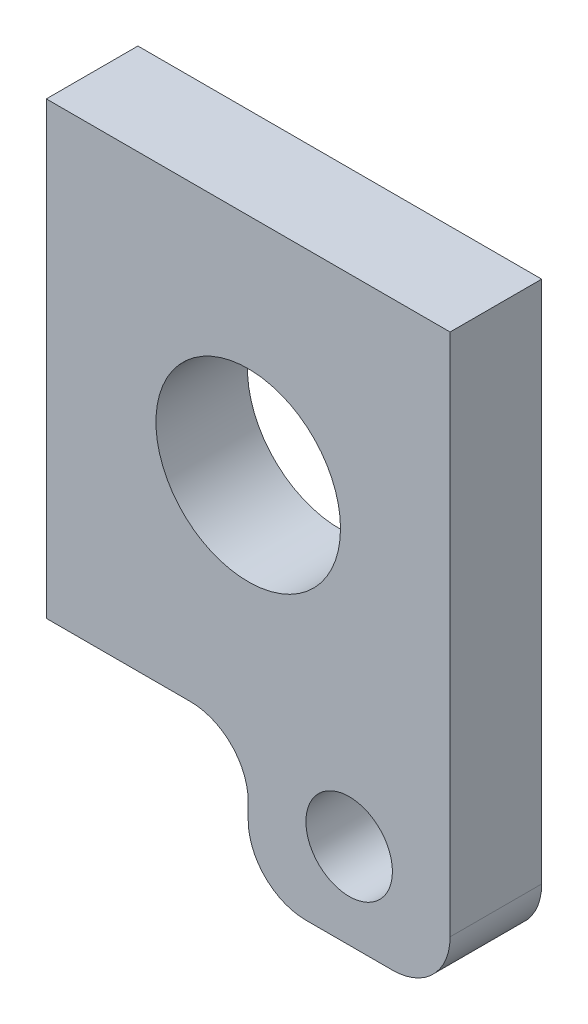
ISO-10303-21;
HEADER;
FILE_DESCRIPTION(('STEP AP214'),'2;1');
FILE_NAME('part.step','',(''),(''),'','','');
FILE_SCHEMA(('AUTOMOTIVE_DESIGN { 1 0 10303 214 1 1 1 1 }'));
ENDSEC;
DATA;
#1=APPLICATION_CONTEXT('core data for automotive mechanical design processes');
#2=APPLICATION_PROTOCOL_DEFINITION('international standard','automotive_design',2000,#1);
#3=PRODUCT_CONTEXT('',#1,'mechanical');
#4=PRODUCT('Part','Part','',(#3));
#5=PRODUCT_RELATED_PRODUCT_CATEGORY('part','',(#4));
#6=PRODUCT_DEFINITION_FORMATION('','',#4);
#7=PRODUCT_DEFINITION_CONTEXT('part definition',#1,'design');
#8=PRODUCT_DEFINITION('design','',#6,#7);
#9=PRODUCT_DEFINITION_SHAPE('','',#8);
#10=(LENGTH_UNIT() NAMED_UNIT(*) SI_UNIT(.MILLI.,.METRE.));
#11=(NAMED_UNIT(*) PLANE_ANGLE_UNIT() SI_UNIT($,.RADIAN.));
#12=(NAMED_UNIT(*) SI_UNIT($,.STERADIAN.) SOLID_ANGLE_UNIT());
#13=UNCERTAINTY_MEASURE_WITH_UNIT(LENGTH_MEASURE(1.E-05),#10,'distance_accuracy_value','');
#14=(GEOMETRIC_REPRESENTATION_CONTEXT(3) GLOBAL_UNCERTAINTY_ASSIGNED_CONTEXT((#13)) GLOBAL_UNIT_ASSIGNED_CONTEXT((#10,
#11,#12)) REPRESENTATION_CONTEXT('',''));
#15=CARTESIAN_POINT('',(0.,0.,0.));
#16=DIRECTION('',(0.,0.,1.));
#17=DIRECTION('',(1.,0.,0.));
#18=AXIS2_PLACEMENT_3D('',#15,#16,#17);
#19=CARTESIAN_POINT('',(0.,0.,1.5875));
#20=DIRECTION('',(0.,0.,-1.));
#21=DIRECTION('',(-1.,0.,0.));
#22=AXIS2_PLACEMENT_3D('',#19,#20,#21);
#23=PLANE('',#22);
#24=DIRECTION('',(1.,0.,0.));
#25=VECTOR('',#24,1.);
#26=CARTESIAN_POINT('',(0.,-6.18125,1.5875));
#27=LINE('',#26,#25);
#28=CARTESIAN_POINT('',(1.,-6.18125,1.5875));
#29=VERTEX_POINT('',#28);
#30=CARTESIAN_POINT('',(2.5,-6.18125,1.5875));
#31=VERTEX_POINT('',#30);
#32=EDGE_CURVE('E141',#29,#31,#27,.T.);
#33=ORIENTED_EDGE('',*,*,#32,.T.);
#34=CARTESIAN_POINT('',(2.5,-5.18125,1.5875));
#35=DIRECTION('',(0.,0.,-1.));
#36=DIRECTION('',(-1.,0.,0.));
#37=AXIS2_PLACEMENT_3D('',#34,#35,#36);
#38=CIRCLE('',#37,1.);
#39=CARTESIAN_POINT('',(3.5,-5.18125,1.5875));
#40=VERTEX_POINT('',#39);
#41=EDGE_CURVE('E111',#31,#40,#38,.F.);
#42=ORIENTED_EDGE('',*,*,#41,.T.);
#43=DIRECTION('',(0.,1.,0.));
#44=VECTOR('',#43,1.);
#45=CARTESIAN_POINT('',(3.5,-3.9,1.5875));
#46=LINE('',#45,#44);
#47=CARTESIAN_POINT('',(3.5,3.9,1.5875));
#48=VERTEX_POINT('',#47);
#49=EDGE_CURVE('E105',#40,#48,#46,.T.);
#50=ORIENTED_EDGE('',*,*,#49,.T.);
#51=DIRECTION('',(-1.,0.,0.));
#52=VECTOR('',#51,1.);
#53=CARTESIAN_POINT('',(-3.5,3.9,1.5875));
#54=LINE('',#53,#52);
#55=CARTESIAN_POINT('',(-3.5,3.9,1.5875));
#56=VERTEX_POINT('',#55);
#57=EDGE_CURVE('E108',#48,#56,#54,.T.);
#58=ORIENTED_EDGE('',*,*,#57,.T.);
#59=DIRECTION('',(0.,-1.,0.));
#60=VECTOR('',#59,1.);
#61=CARTESIAN_POINT('',(-3.5,-3.9,1.5875));
#62=LINE('',#61,#60);
#63=CARTESIAN_POINT('',(-3.5,-3.9,1.5875));
#64=VERTEX_POINT('',#63);
#65=EDGE_CURVE('E125',#56,#64,#62,.T.);
#66=ORIENTED_EDGE('',*,*,#65,.T.);
#67=DIRECTION('',(1.,0.,0.));
#68=VECTOR('',#67,1.);
#69=CARTESIAN_POINT('',(0.,-3.9,1.5875));
#70=LINE('',#69,#68);
#71=CARTESIAN_POINT('',(-1.,-3.9,1.5875));
#72=VERTEX_POINT('',#71);
#73=EDGE_CURVE('E182',#64,#72,#70,.T.);
#74=ORIENTED_EDGE('',*,*,#73,.T.);
#75=CARTESIAN_POINT('',(-1.,-4.9,1.5875));
#76=DIRECTION('',(0.,0.,-1.));
#77=DIRECTION('',(-1.,0.,0.));
#78=AXIS2_PLACEMENT_3D('',#75,#76,#77);
#79=CIRCLE('',#78,1.);
#80=CARTESIAN_POINT('',(0.,-4.9,1.5875));
#81=VERTEX_POINT('',#80);
#82=EDGE_CURVE('E12',#72,#81,#79,.T.);
#83=ORIENTED_EDGE('',*,*,#82,.T.);
#84=DIRECTION('',(0.,-1.,0.));
#85=VECTOR('',#84,1.);
#86=CARTESIAN_POINT('',(0.,-6.28125,1.5875));
#87=LINE('',#86,#85);
#88=CARTESIAN_POINT('',(0.,-5.18125,1.5875));
#89=VERTEX_POINT('',#88);
#90=EDGE_CURVE('E142',#81,#89,#87,.T.);
#91=ORIENTED_EDGE('',*,*,#90,.T.);
#92=CARTESIAN_POINT('',(1.,-5.18125,1.5875));
#93=DIRECTION('',(0.,0.,-1.));
#94=DIRECTION('',(-1.,0.,0.));
#95=AXIS2_PLACEMENT_3D('',#92,#93,#94);
#96=CIRCLE('',#95,1.);
#97=EDGE_CURVE('E57',#89,#29,#96,.F.);
#98=ORIENTED_EDGE('',*,*,#97,.T.);
#99=EDGE_LOOP('',(#33,#42,#50,#58,#66,#74,#83,#91,#98));
#100=FACE_BOUND('',#99,.T.);
#101=CARTESIAN_POINT('',(0.,0.,1.5875));
#102=DIRECTION('',(0.,0.,1.));
#103=DIRECTION('',(1.,0.,0.));
#104=AXIS2_PLACEMENT_3D('',#101,#102,#103);
#105=CIRCLE('',#104,1.6);
#106=CARTESIAN_POINT('',(1.6,0.,1.5875));
#107=VERTEX_POINT('',#106);
#108=EDGE_CURVE('E192',#107,#107,#105,.T.);
#109=ORIENTED_EDGE('',*,*,#108,.F.);
#110=EDGE_LOOP('',(#109));
#111=FACE_BOUND('',#110,.T.);
#112=CARTESIAN_POINT('',(1.75,-4.7,1.5875));
#113=DIRECTION('',(0.,0.,1.));
#114=DIRECTION('',(1.,0.,0.));
#115=AXIS2_PLACEMENT_3D('',#112,#113,#114);
#116=CIRCLE('',#115,0.75);
#117=CARTESIAN_POINT('',(2.5,-4.7,1.5875));
#118=VERTEX_POINT('',#117);
#119=EDGE_CURVE('E316',#118,#118,#116,.T.);
#120=ORIENTED_EDGE('',*,*,#119,.F.);
#121=EDGE_LOOP('',(#120));
#122=FACE_BOUND('',#121,.T.);
#123=ADVANCED_FACE('F35',(#100,#111,#122),#23,.F.);
#124=CARTESIAN_POINT('',(0.,0.,0.));
#125=DIRECTION('',(0.,0.,-1.));
#126=DIRECTION('',(-1.,0.,0.));
#127=AXIS2_PLACEMENT_3D('',#124,#125,#126);
#128=PLANE('',#127);
#129=CARTESIAN_POINT('',(0.,0.,0.));
#130=DIRECTION('',(0.,0.,1.));
#131=DIRECTION('',(1.,0.,0.));
#132=AXIS2_PLACEMENT_3D('',#129,#130,#131);
#133=CIRCLE('',#132,1.6);
#134=CARTESIAN_POINT('',(1.6,0.,0.));
#135=VERTEX_POINT('',#134);
#136=EDGE_CURVE('E321',#135,#135,#133,.T.);
#137=ORIENTED_EDGE('',*,*,#136,.T.);
#138=EDGE_LOOP('',(#137));
#139=FACE_BOUND('',#138,.T.);
#140=DIRECTION('',(0.,1.,0.));
#141=VECTOR('',#140,1.);
#142=CARTESIAN_POINT('',(3.5,-6.28125,0.));
#143=LINE('',#142,#141);
#144=CARTESIAN_POINT('',(3.5,-5.18125,0.));
#145=VERTEX_POINT('',#144);
#146=CARTESIAN_POINT('',(3.5,3.9,0.));
#147=VERTEX_POINT('',#146);
#148=EDGE_CURVE('E116',#145,#147,#143,.T.);
#149=ORIENTED_EDGE('',*,*,#148,.F.);
#150=CARTESIAN_POINT('',(2.5,-5.18125,0.));
#151=DIRECTION('',(0.,0.,-1.));
#152=DIRECTION('',(-1.,0.,0.));
#153=AXIS2_PLACEMENT_3D('',#150,#151,#152);
#154=CIRCLE('',#153,1.);
#155=CARTESIAN_POINT('',(2.5,-6.18125,0.));
#156=VERTEX_POINT('',#155);
#157=EDGE_CURVE('E152',#145,#156,#154,.T.);
#158=ORIENTED_EDGE('',*,*,#157,.T.);
#159=DIRECTION('',(1.,0.,0.));
#160=VECTOR('',#159,1.);
#161=CARTESIAN_POINT('',(0.,-6.18125,0.));
#162=LINE('',#161,#160);
#163=CARTESIAN_POINT('',(1.,-6.18125,0.));
#164=VERTEX_POINT('',#163);
#165=EDGE_CURVE('E138',#164,#156,#162,.T.);
#166=ORIENTED_EDGE('',*,*,#165,.F.);
#167=CARTESIAN_POINT('',(1.,-5.18125,0.));
#168=DIRECTION('',(0.,0.,-1.));
#169=DIRECTION('',(-1.,0.,0.));
#170=AXIS2_PLACEMENT_3D('',#167,#168,#169);
#171=CIRCLE('',#170,1.);
#172=CARTESIAN_POINT('',(0.,-5.18125,0.));
#173=VERTEX_POINT('',#172);
#174=EDGE_CURVE('E150',#164,#173,#171,.T.);
#175=ORIENTED_EDGE('',*,*,#174,.T.);
#176=DIRECTION('',(0.,-1.,0.));
#177=VECTOR('',#176,1.);
#178=CARTESIAN_POINT('',(0.,-6.28125,0.));
#179=LINE('',#178,#177);
#180=CARTESIAN_POINT('',(0.,-4.9,0.));
#181=VERTEX_POINT('',#180);
#182=EDGE_CURVE('E140',#181,#173,#179,.T.);
#183=ORIENTED_EDGE('',*,*,#182,.F.);
#184=CARTESIAN_POINT('',(-1.,-4.9,0.));
#185=DIRECTION('',(0.,0.,-1.));
#186=DIRECTION('',(-1.,0.,0.));
#187=AXIS2_PLACEMENT_3D('',#184,#185,#186);
#188=CIRCLE('',#187,1.);
#189=CARTESIAN_POINT('',(-1.,-3.9,0.));
#190=VERTEX_POINT('',#189);
#191=EDGE_CURVE('E43',#181,#190,#188,.F.);
#192=ORIENTED_EDGE('',*,*,#191,.T.);
#193=DIRECTION('',(1.,0.,0.));
#194=VECTOR('',#193,1.);
#195=CARTESIAN_POINT('',(0.,-3.9,0.));
#196=LINE('',#195,#194);
#197=CARTESIAN_POINT('',(-3.5,-3.9,0.));
#198=VERTEX_POINT('',#197);
#199=EDGE_CURVE('E166',#198,#190,#196,.T.);
#200=ORIENTED_EDGE('',*,*,#199,.F.);
#201=DIRECTION('',(0.,-1.,0.));
#202=VECTOR('',#201,1.);
#203=CARTESIAN_POINT('',(-3.5,-3.9,0.));
#204=LINE('',#203,#202);
#205=CARTESIAN_POINT('',(-3.5,3.9,0.));
#206=VERTEX_POINT('',#205);
#207=EDGE_CURVE('E177',#206,#198,#204,.T.);
#208=ORIENTED_EDGE('',*,*,#207,.F.);
#209=DIRECTION('',(-1.,0.,0.));
#210=VECTOR('',#209,1.);
#211=CARTESIAN_POINT('',(-3.5,3.9,0.));
#212=LINE('',#211,#210);
#213=EDGE_CURVE('E190',#147,#206,#212,.T.);
#214=ORIENTED_EDGE('',*,*,#213,.F.);
#215=EDGE_LOOP('',(#149,#158,#166,#175,#183,#192,#200,#208,#214));
#216=FACE_BOUND('',#215,.T.);
#217=CARTESIAN_POINT('',(1.75,-4.7,0.));
#218=DIRECTION('',(0.,0.,1.));
#219=DIRECTION('',(1.,0.,0.));
#220=AXIS2_PLACEMENT_3D('',#217,#218,#219);
#221=CIRCLE('',#220,0.75);
#222=CARTESIAN_POINT('',(2.5,-4.7,0.));
#223=VERTEX_POINT('',#222);
#224=EDGE_CURVE('E319',#223,#223,#221,.T.);
#225=ORIENTED_EDGE('',*,*,#224,.T.);
#226=EDGE_LOOP('',(#225));
#227=FACE_BOUND('',#226,.T.);
#228=ADVANCED_FACE('F163',(#139,#216,#227),#128,.T.);
#229=CARTESIAN_POINT('',(-3.5,3.9,1.5875));
#230=DIRECTION('',(0.,-1.,0.));
#231=DIRECTION('',(1.,0.,0.));
#232=AXIS2_PLACEMENT_3D('',#229,#230,#231);
#233=PLANE('',#232);
#234=ORIENTED_EDGE('',*,*,#213,.T.);
#235=DIRECTION('',(0.,0.,-1.));
#236=VECTOR('',#235,1.);
#237=CARTESIAN_POINT('',(-3.5,3.9,1.5875));
#238=LINE('',#237,#236);
#239=EDGE_CURVE('E123',#56,#206,#238,.T.);
#240=ORIENTED_EDGE('',*,*,#239,.F.);
#241=ORIENTED_EDGE('',*,*,#57,.F.);
#242=DIRECTION('',(0.,0.,-1.));
#243=VECTOR('',#242,1.);
#244=CARTESIAN_POINT('',(3.5,3.9,1.5875));
#245=LINE('',#244,#243);
#246=EDGE_CURVE('E121',#48,#147,#245,.T.);
#247=ORIENTED_EDGE('',*,*,#246,.T.);
#248=EDGE_LOOP('',(#234,#240,#241,#247));
#249=FACE_BOUND('',#248,.T.);
#250=ADVANCED_FACE('F120',(#249),#233,.F.);
#251=CARTESIAN_POINT('',(-3.5,-3.9,1.5875));
#252=DIRECTION('',(1.,0.,0.));
#253=DIRECTION('',(0.,1.,0.));
#254=AXIS2_PLACEMENT_3D('',#251,#252,#253);
#255=PLANE('',#254);
#256=ORIENTED_EDGE('',*,*,#207,.T.);
#257=DIRECTION('',(0.,0.,-1.));
#258=VECTOR('',#257,1.);
#259=CARTESIAN_POINT('',(-3.5,-3.9,1.5875));
#260=LINE('',#259,#258);
#261=EDGE_CURVE('E134',#64,#198,#260,.T.);
#262=ORIENTED_EDGE('',*,*,#261,.F.);
#263=ORIENTED_EDGE('',*,*,#65,.F.);
#264=ORIENTED_EDGE('',*,*,#239,.T.);
#265=EDGE_LOOP('',(#256,#262,#263,#264));
#266=FACE_BOUND('',#265,.T.);
#267=ADVANCED_FACE('F225',(#266),#255,.F.);
#268=CARTESIAN_POINT('',(0.,-3.9,1.5875));
#269=DIRECTION('',(0.,1.,0.));
#270=DIRECTION('',(0.,0.,1.));
#271=AXIS2_PLACEMENT_3D('',#268,#269,#270);
#272=PLANE('',#271);
#273=ORIENTED_EDGE('',*,*,#199,.T.);
#274=DIRECTION('',(0.,0.,-1.));
#275=VECTOR('',#274,1.);
#276=CARTESIAN_POINT('',(-1.,-3.9,1.5875));
#277=LINE('',#276,#275);
#278=EDGE_CURVE('E146',#190,#72,#277,.F.);
#279=ORIENTED_EDGE('',*,*,#278,.T.);
#280=ORIENTED_EDGE('',*,*,#73,.F.);
#281=ORIENTED_EDGE('',*,*,#261,.T.);
#282=EDGE_LOOP('',(#273,#279,#280,#281));
#283=FACE_BOUND('',#282,.T.);
#284=ADVANCED_FACE('F173',(#283),#272,.F.);
#285=CARTESIAN_POINT('',(0.,-6.28125,1.5875));
#286=DIRECTION('',(1.,0.,0.));
#287=DIRECTION('',(0.,0.,-1.));
#288=AXIS2_PLACEMENT_3D('',#285,#286,#287);
#289=PLANE('',#288);
#290=ORIENTED_EDGE('',*,*,#90,.F.);
#291=DIRECTION('',(0.,0.,-1.));
#292=VECTOR('',#291,1.);
#293=CARTESIAN_POINT('',(0.,-4.9,0.));
#294=LINE('',#293,#292);
#295=EDGE_CURVE('E132',#81,#181,#294,.T.);
#296=ORIENTED_EDGE('',*,*,#295,.T.);
#297=ORIENTED_EDGE('',*,*,#182,.T.);
#298=DIRECTION('',(0.,0.,-1.));
#299=VECTOR('',#298,1.);
#300=CARTESIAN_POINT('',(0.,-5.18125,1.5875));
#301=LINE('',#300,#299);
#302=EDGE_CURVE('E130',#173,#89,#301,.F.);
#303=ORIENTED_EDGE('',*,*,#302,.T.);
#304=EDGE_LOOP('',(#290,#296,#297,#303));
#305=FACE_BOUND('',#304,.T.);
#306=ADVANCED_FACE('F184',(#305),#289,.F.);
#307=CARTESIAN_POINT('',(0.,-6.18125,1.5875));
#308=DIRECTION('',(0.,1.,0.));
#309=DIRECTION('',(0.,0.,1.));
#310=AXIS2_PLACEMENT_3D('',#307,#308,#309);
#311=PLANE('',#310);
#312=ORIENTED_EDGE('',*,*,#165,.T.);
#313=DIRECTION('',(0.,0.,-1.));
#314=VECTOR('',#313,1.);
#315=CARTESIAN_POINT('',(2.5,-6.18125,1.5875));
#316=LINE('',#315,#314);
#317=EDGE_CURVE('E50',#156,#31,#316,.F.);
#318=ORIENTED_EDGE('',*,*,#317,.T.);
#319=ORIENTED_EDGE('',*,*,#32,.F.);
#320=DIRECTION('',(0.,0.,-1.));
#321=VECTOR('',#320,1.);
#322=CARTESIAN_POINT('',(1.,-6.18125,1.5875));
#323=LINE('',#322,#321);
#324=EDGE_CURVE('E154',#29,#164,#323,.T.);
#325=ORIENTED_EDGE('',*,*,#324,.T.);
#326=EDGE_LOOP('',(#312,#318,#319,#325));
#327=FACE_BOUND('',#326,.T.);
#328=ADVANCED_FACE('F198',(#327),#311,.F.);
#329=CARTESIAN_POINT('',(3.5,-6.28125,1.5875));
#330=DIRECTION('',(-1.,0.,0.));
#331=DIRECTION('',(0.,-1.,0.));
#332=AXIS2_PLACEMENT_3D('',#329,#330,#331);
#333=PLANE('',#332);
#334=ORIENTED_EDGE('',*,*,#49,.F.);
#335=DIRECTION('',(0.,0.,-1.));
#336=VECTOR('',#335,1.);
#337=CARTESIAN_POINT('',(3.5,-5.18125,1.5875));
#338=LINE('',#337,#336);
#339=EDGE_CURVE('E148',#40,#145,#338,.T.);
#340=ORIENTED_EDGE('',*,*,#339,.T.);
#341=ORIENTED_EDGE('',*,*,#148,.T.);
#342=ORIENTED_EDGE('',*,*,#246,.F.);
#343=EDGE_LOOP('',(#334,#340,#341,#342));
#344=FACE_BOUND('',#343,.T.);
#345=ADVANCED_FACE('F127',(#344),#333,.F.);
#346=CARTESIAN_POINT('',(0.,0.,1.5875));
#347=DIRECTION('',(0.,0.,-1.));
#348=DIRECTION('',(-1.,0.,0.));
#349=AXIS2_PLACEMENT_3D('',#346,#347,#348);
#350=CYLINDRICAL_SURFACE('',#349,1.6);
#351=ORIENTED_EDGE('',*,*,#108,.T.);
#352=EDGE_LOOP('',(#351));
#353=FACE_BOUND('',#352,.T.);
#354=ORIENTED_EDGE('',*,*,#136,.F.);
#355=EDGE_LOOP('',(#354));
#356=FACE_BOUND('',#355,.T.);
#357=ADVANCED_FACE('F216',(#353,#356),#350,.F.);
#358=CARTESIAN_POINT('',(1.75,-4.7,1.5875));
#359=DIRECTION('',(0.,0.,-1.));
#360=DIRECTION('',(-1.,0.,0.));
#361=AXIS2_PLACEMENT_3D('',#358,#359,#360);
#362=CYLINDRICAL_SURFACE('',#361,0.75);
#363=ORIENTED_EDGE('',*,*,#119,.T.);
#364=EDGE_LOOP('',(#363));
#365=FACE_BOUND('',#364,.T.);
#366=ORIENTED_EDGE('',*,*,#224,.F.);
#367=EDGE_LOOP('',(#366));
#368=FACE_BOUND('',#367,.T.);
#369=ADVANCED_FACE('F206',(#365,#368),#362,.F.);
#370=CARTESIAN_POINT('',(-1.,-4.9,1.5875));
#371=DIRECTION('',(0.,0.,1.));
#372=DIRECTION('',(1.,0.,0.));
#373=AXIS2_PLACEMENT_3D('',#370,#371,#372);
#374=CYLINDRICAL_SURFACE('',#373,1.);
#375=ORIENTED_EDGE('',*,*,#82,.F.);
#376=ORIENTED_EDGE('',*,*,#278,.F.);
#377=ORIENTED_EDGE('',*,*,#191,.F.);
#378=ORIENTED_EDGE('',*,*,#295,.F.);
#379=EDGE_LOOP('',(#375,#376,#377,#378));
#380=FACE_BOUND('',#379,.T.);
#381=ADVANCED_FACE('F180',(#380),#374,.F.);
#382=CARTESIAN_POINT('',(2.5,-5.18125,1.5875));
#383=DIRECTION('',(0.,0.,-1.));
#384=DIRECTION('',(-1.,0.,0.));
#385=AXIS2_PLACEMENT_3D('',#382,#383,#384);
#386=CYLINDRICAL_SURFACE('',#385,1.);
#387=ORIENTED_EDGE('',*,*,#41,.F.);
#388=ORIENTED_EDGE('',*,*,#317,.F.);
#389=ORIENTED_EDGE('',*,*,#157,.F.);
#390=ORIENTED_EDGE('',*,*,#339,.F.);
#391=EDGE_LOOP('',(#387,#388,#389,#390));
#392=FACE_BOUND('',#391,.T.);
#393=ADVANCED_FACE('F200',(#392),#386,.T.);
#394=CARTESIAN_POINT('',(1.,-5.18125,1.5875));
#395=DIRECTION('',(0.,0.,-1.));
#396=DIRECTION('',(-1.,0.,0.));
#397=AXIS2_PLACEMENT_3D('',#394,#395,#396);
#398=CYLINDRICAL_SURFACE('',#397,1.);
#399=ORIENTED_EDGE('',*,*,#97,.F.);
#400=ORIENTED_EDGE('',*,*,#302,.F.);
#401=ORIENTED_EDGE('',*,*,#174,.F.);
#402=ORIENTED_EDGE('',*,*,#324,.F.);
#403=EDGE_LOOP('',(#399,#400,#401,#402));
#404=FACE_BOUND('',#403,.T.);
#405=ADVANCED_FACE('F37',(#404),#398,.T.);
#406=CLOSED_SHELL('',(#123,#228,#250,#267,#284,#306,#328,#345,#357,#369,#381,#393,#405));
#407=MANIFOLD_SOLID_BREP('B2',#406);
#408=ADVANCED_BREP_SHAPE_REPRESENTATION('',(#18,#407),#14);
#409=SHAPE_DEFINITION_REPRESENTATION(#9,#408);
ENDSEC;
END-ISO-10303-21;
